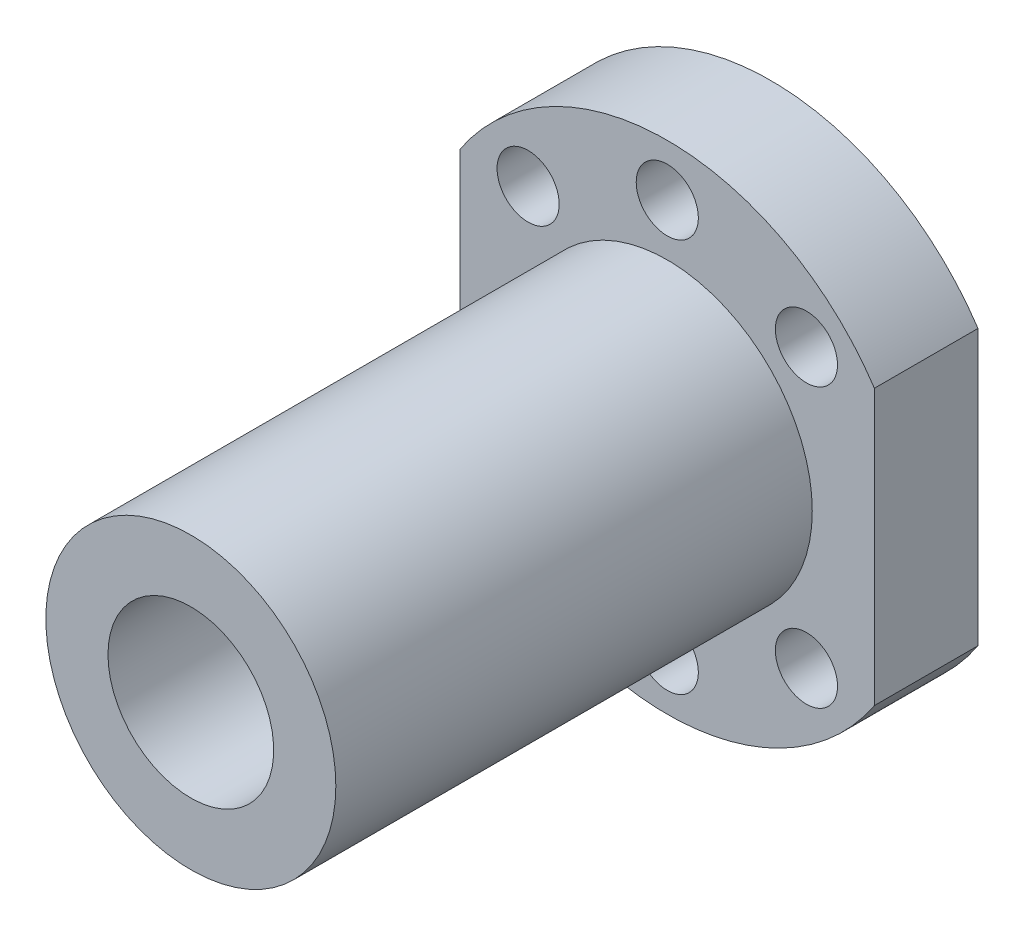
ISO-10303-21;
HEADER;
FILE_DESCRIPTION(('STEP AP214'),'2;1');
FILE_NAME('part.step','',(''),(''),'','','');
FILE_SCHEMA(('AUTOMOTIVE_DESIGN { 1 0 10303 214 1 1 1 1 }'));
ENDSEC;
DATA;
#1=APPLICATION_CONTEXT('core data for automotive mechanical design processes');
#2=APPLICATION_PROTOCOL_DEFINITION('international standard','automotive_design',2000,#1);
#3=PRODUCT_CONTEXT('',#1,'mechanical');
#4=PRODUCT('Part','Part','',(#3));
#5=PRODUCT_RELATED_PRODUCT_CATEGORY('part','',(#4));
#6=PRODUCT_DEFINITION_FORMATION('','',#4);
#7=PRODUCT_DEFINITION_CONTEXT('part definition',#1,'design');
#8=PRODUCT_DEFINITION('design','',#6,#7);
#9=PRODUCT_DEFINITION_SHAPE('','',#8);
#10=(LENGTH_UNIT() NAMED_UNIT(*) SI_UNIT(.MILLI.,.METRE.));
#11=(NAMED_UNIT(*) PLANE_ANGLE_UNIT() SI_UNIT($,.RADIAN.));
#12=(NAMED_UNIT(*) SI_UNIT($,.STERADIAN.) SOLID_ANGLE_UNIT());
#13=UNCERTAINTY_MEASURE_WITH_UNIT(LENGTH_MEASURE(1.E-05),#10,'distance_accuracy_value','');
#14=(GEOMETRIC_REPRESENTATION_CONTEXT(3) GLOBAL_UNCERTAINTY_ASSIGNED_CONTEXT((#13)) GLOBAL_UNIT_ASSIGNED_CONTEXT((#10,
#11,#12)) REPRESENTATION_CONTEXT('',''));
#15=CARTESIAN_POINT('',(0.,0.,0.));
#16=DIRECTION('',(0.,0.,1.));
#17=DIRECTION('',(1.,0.,0.));
#18=AXIS2_PLACEMENT_3D('',#15,#16,#17);
#19=CARTESIAN_POINT('',(0.,0.,0.));
#20=DIRECTION('',(0.,0.,1.));
#21=DIRECTION('',(1.,0.,0.));
#22=AXIS2_PLACEMENT_3D('',#19,#20,#21);
#23=PLANE('',#22);
#24=CARTESIAN_POINT('',(0.,0.,0.));
#25=DIRECTION('',(0.,0.,-1.));
#26=DIRECTION('',(-1.,0.,0.));
#27=AXIS2_PLACEMENT_3D('',#24,#25,#26);
#28=CIRCLE('',#27,7.99999999999999);
#29=CARTESIAN_POINT('',(-7.99999999999999,0.,0.));
#30=VERTEX_POINT('',#29);
#31=EDGE_CURVE('E145',#30,#30,#28,.T.);
#32=ORIENTED_EDGE('',*,*,#31,.F.);
#33=EDGE_LOOP('',(#32));
#34=FACE_BOUND('',#33,.T.);
#35=DIRECTION('',(0.,-1.,0.));
#36=VECTOR('',#35,1.);
#37=CARTESIAN_POINT('',(-20.,0.,0.));
#38=LINE('',#37,#36);
#39=CARTESIAN_POINT('',(-20.,13.2664991614216,0.));
#40=VERTEX_POINT('',#39);
#41=CARTESIAN_POINT('',(-20.,-13.2664991614216,0.));
#42=VERTEX_POINT('',#41);
#43=EDGE_CURVE('E12',#40,#42,#38,.T.);
#44=ORIENTED_EDGE('',*,*,#43,.F.);
#45=CARTESIAN_POINT('',(0.,0.,0.));
#46=DIRECTION('',(0.,0.,1.));
#47=DIRECTION('',(1.,0.,0.));
#48=AXIS2_PLACEMENT_3D('',#45,#46,#47);
#49=CIRCLE('',#48,24.);
#50=CARTESIAN_POINT('',(20.,13.2664991614216,0.));
#51=VERTEX_POINT('',#50);
#52=EDGE_CURVE('E84',#51,#40,#49,.T.);
#53=ORIENTED_EDGE('',*,*,#52,.F.);
#54=DIRECTION('',(0.,1.,0.));
#55=VECTOR('',#54,1.);
#56=CARTESIAN_POINT('',(20.,0.,0.));
#57=LINE('',#56,#55);
#58=CARTESIAN_POINT('',(20.,-13.2664991614216,0.));
#59=VERTEX_POINT('',#58);
#60=EDGE_CURVE('E42',#59,#51,#57,.T.);
#61=ORIENTED_EDGE('',*,*,#60,.F.);
#62=EDGE_CURVE('E91',#42,#59,#49,.T.);
#63=ORIENTED_EDGE('',*,*,#62,.F.);
#64=EDGE_LOOP('',(#44,#53,#61,#63));
#65=FACE_BOUND('',#64,.T.);
#66=CARTESIAN_POINT('',(0.,19.,0.));
#67=DIRECTION('',(0.,0.,-1.));
#68=DIRECTION('',(-1.,0.,0.));
#69=AXIS2_PLACEMENT_3D('',#66,#67,#68);
#70=CIRCLE('',#69,2.99999999999999);
#71=CARTESIAN_POINT('',(-2.99999999999999,19.,0.));
#72=VERTEX_POINT('',#71);
#73=EDGE_CURVE('E112',#72,#72,#70,.T.);
#74=ORIENTED_EDGE('',*,*,#73,.F.);
#75=EDGE_LOOP('',(#74));
#76=FACE_BOUND('',#75,.T.);
#77=CARTESIAN_POINT('',(-13.4350288425444,13.4350288425444,0.));
#78=DIRECTION('',(0.,0.,-1.));
#79=DIRECTION('',(-1.,0.,0.));
#80=AXIS2_PLACEMENT_3D('',#77,#78,#79);
#81=CIRCLE('',#80,2.99999999999999);
#82=CARTESIAN_POINT('',(-16.4350288425444,13.4350288425444,0.));
#83=VERTEX_POINT('',#82);
#84=EDGE_CURVE('E118',#83,#83,#81,.T.);
#85=ORIENTED_EDGE('',*,*,#84,.F.);
#86=EDGE_LOOP('',(#85));
#87=FACE_BOUND('',#86,.T.);
#88=CARTESIAN_POINT('',(-13.4350288425443,-13.4350288425445,0.));
#89=DIRECTION('',(0.,0.,-1.));
#90=DIRECTION('',(-1.,0.,0.));
#91=AXIS2_PLACEMENT_3D('',#88,#89,#90);
#92=CIRCLE('',#91,2.99999999999999);
#93=CARTESIAN_POINT('',(-16.4350288425443,-13.4350288425445,0.));
#94=VERTEX_POINT('',#93);
#95=EDGE_CURVE('E124',#94,#94,#92,.T.);
#96=ORIENTED_EDGE('',*,*,#95,.F.);
#97=EDGE_LOOP('',(#96));
#98=FACE_BOUND('',#97,.T.);
#99=CARTESIAN_POINT('',(1.32676290876039E-13,-19.,0.));
#100=DIRECTION('',(0.,0.,-1.));
#101=DIRECTION('',(-1.,0.,0.));
#102=AXIS2_PLACEMENT_3D('',#99,#100,#101);
#103=CIRCLE('',#102,2.99999999999999);
#104=CARTESIAN_POINT('',(-2.99999999999986,-19.,0.));
#105=VERTEX_POINT('',#104);
#106=EDGE_CURVE('E130',#105,#105,#103,.T.);
#107=ORIENTED_EDGE('',*,*,#106,.F.);
#108=EDGE_LOOP('',(#107));
#109=FACE_BOUND('',#108,.T.);
#110=CARTESIAN_POINT('',(13.4350288425445,-13.4350288425443,0.));
#111=DIRECTION('',(0.,0.,-1.));
#112=DIRECTION('',(-1.,0.,0.));
#113=AXIS2_PLACEMENT_3D('',#110,#111,#112);
#114=CIRCLE('',#113,2.99999999999999);
#115=CARTESIAN_POINT('',(10.4350288425445,-13.4350288425443,0.));
#116=VERTEX_POINT('',#115);
#117=EDGE_CURVE('E136',#116,#116,#114,.T.);
#118=ORIENTED_EDGE('',*,*,#117,.F.);
#119=EDGE_LOOP('',(#118));
#120=FACE_BOUND('',#119,.T.);
#121=CARTESIAN_POINT('',(13.4350288425442,13.4350288425446,0.));
#122=DIRECTION('',(0.,0.,-1.));
#123=DIRECTION('',(-1.,0.,0.));
#124=AXIS2_PLACEMENT_3D('',#121,#122,#123);
#125=CIRCLE('',#124,2.99999999999999);
#126=CARTESIAN_POINT('',(10.4350288425443,13.4350288425446,0.));
#127=VERTEX_POINT('',#126);
#128=EDGE_CURVE('E139',#127,#127,#125,.T.);
#129=ORIENTED_EDGE('',*,*,#128,.F.);
#130=EDGE_LOOP('',(#129));
#131=FACE_BOUND('',#130,.T.);
#132=ADVANCED_FACE('F33',(#34,#65,#76,#87,#98,#109,#120,#131),#23,.F.);
#133=CARTESIAN_POINT('',(0.,0.,10.));
#134=DIRECTION('',(0.,0.,1.));
#135=DIRECTION('',(1.,0.,0.));
#136=AXIS2_PLACEMENT_3D('',#133,#134,#135);
#137=PLANE('',#136);
#138=CARTESIAN_POINT('',(13.4350288425442,13.4350288425446,10.));
#139=DIRECTION('',(0.,0.,1.));
#140=DIRECTION('',(1.,0.,0.));
#141=AXIS2_PLACEMENT_3D('',#138,#139,#140);
#142=CIRCLE('',#141,2.99999999999999);
#143=CARTESIAN_POINT('',(16.4350288425442,13.4350288425446,10.));
#144=VERTEX_POINT('',#143);
#145=EDGE_CURVE('E37',#144,#144,#142,.T.);
#146=ORIENTED_EDGE('',*,*,#145,.F.);
#147=EDGE_LOOP('',(#146));
#148=FACE_BOUND('',#147,.T.);
#149=CARTESIAN_POINT('',(13.4350288425445,-13.4350288425443,10.));
#150=DIRECTION('',(0.,0.,1.));
#151=DIRECTION('',(1.,0.,0.));
#152=AXIS2_PLACEMENT_3D('',#149,#150,#151);
#153=CIRCLE('',#152,2.99999999999999);
#154=CARTESIAN_POINT('',(16.4350288425445,-13.4350288425443,10.));
#155=VERTEX_POINT('',#154);
#156=EDGE_CURVE('E133',#155,#155,#153,.T.);
#157=ORIENTED_EDGE('',*,*,#156,.F.);
#158=EDGE_LOOP('',(#157));
#159=FACE_BOUND('',#158,.T.);
#160=CARTESIAN_POINT('',(1.32676290876039E-13,-19.,10.));
#161=DIRECTION('',(0.,0.,1.));
#162=DIRECTION('',(1.,0.,0.));
#163=AXIS2_PLACEMENT_3D('',#160,#161,#162);
#164=CIRCLE('',#163,2.99999999999999);
#165=CARTESIAN_POINT('',(3.00000000000012,-19.,10.));
#166=VERTEX_POINT('',#165);
#167=EDGE_CURVE('E127',#166,#166,#164,.T.);
#168=ORIENTED_EDGE('',*,*,#167,.F.);
#169=EDGE_LOOP('',(#168));
#170=FACE_BOUND('',#169,.T.);
#171=CARTESIAN_POINT('',(-13.4350288425443,-13.4350288425445,10.));
#172=DIRECTION('',(0.,0.,1.));
#173=DIRECTION('',(1.,0.,0.));
#174=AXIS2_PLACEMENT_3D('',#171,#172,#173);
#175=CIRCLE('',#174,2.99999999999999);
#176=CARTESIAN_POINT('',(-10.4350288425443,-13.4350288425445,10.));
#177=VERTEX_POINT('',#176);
#178=EDGE_CURVE('E121',#177,#177,#175,.T.);
#179=ORIENTED_EDGE('',*,*,#178,.F.);
#180=EDGE_LOOP('',(#179));
#181=FACE_BOUND('',#180,.T.);
#182=CARTESIAN_POINT('',(-13.4350288425444,13.4350288425444,10.));
#183=DIRECTION('',(0.,0.,1.));
#184=DIRECTION('',(1.,0.,0.));
#185=AXIS2_PLACEMENT_3D('',#182,#183,#184);
#186=CIRCLE('',#185,2.99999999999999);
#187=CARTESIAN_POINT('',(-10.4350288425444,13.4350288425444,10.));
#188=VERTEX_POINT('',#187);
#189=EDGE_CURVE('E115',#188,#188,#186,.T.);
#190=ORIENTED_EDGE('',*,*,#189,.F.);
#191=EDGE_LOOP('',(#190));
#192=FACE_BOUND('',#191,.T.);
#193=CARTESIAN_POINT('',(0.,19.,10.));
#194=DIRECTION('',(0.,0.,1.));
#195=DIRECTION('',(1.,0.,0.));
#196=AXIS2_PLACEMENT_3D('',#193,#194,#195);
#197=CIRCLE('',#196,2.99999999999999);
#198=CARTESIAN_POINT('',(2.99999999999999,19.,10.));
#199=VERTEX_POINT('',#198);
#200=EDGE_CURVE('E87',#199,#199,#197,.T.);
#201=ORIENTED_EDGE('',*,*,#200,.F.);
#202=EDGE_LOOP('',(#201));
#203=FACE_BOUND('',#202,.T.);
#204=CARTESIAN_POINT('',(0.,0.,10.));
#205=DIRECTION('',(0.,0.,1.));
#206=DIRECTION('',(1.,0.,0.));
#207=AXIS2_PLACEMENT_3D('',#204,#205,#206);
#208=CIRCLE('',#207,14.);
#209=CARTESIAN_POINT('',(14.,0.,10.));
#210=VERTEX_POINT('',#209);
#211=EDGE_CURVE('E97',#210,#210,#208,.T.);
#212=ORIENTED_EDGE('',*,*,#211,.F.);
#213=EDGE_LOOP('',(#212));
#214=FACE_BOUND('',#213,.T.);
#215=CARTESIAN_POINT('',(0.,0.,10.));
#216=DIRECTION('',(0.,0.,1.));
#217=DIRECTION('',(1.,0.,0.));
#218=AXIS2_PLACEMENT_3D('',#215,#216,#217);
#219=CIRCLE('',#218,24.);
#220=CARTESIAN_POINT('',(20.,13.2664991614216,10.));
#221=VERTEX_POINT('',#220);
#222=CARTESIAN_POINT('',(-20.,13.2664991614216,10.));
#223=VERTEX_POINT('',#222);
#224=EDGE_CURVE('E79',#221,#223,#219,.T.);
#225=ORIENTED_EDGE('',*,*,#224,.T.);
#226=DIRECTION('',(0.,-1.,0.));
#227=VECTOR('',#226,1.);
#228=CARTESIAN_POINT('',(-20.,0.,10.));
#229=LINE('',#228,#227);
#230=CARTESIAN_POINT('',(-20.,-13.2664991614216,10.));
#231=VERTEX_POINT('',#230);
#232=EDGE_CURVE('E103',#223,#231,#229,.T.);
#233=ORIENTED_EDGE('',*,*,#232,.T.);
#234=CARTESIAN_POINT('',(20.,-13.2664991614216,10.));
#235=VERTEX_POINT('',#234);
#236=EDGE_CURVE('E90',#231,#235,#219,.T.);
#237=ORIENTED_EDGE('',*,*,#236,.T.);
#238=DIRECTION('',(0.,1.,0.));
#239=VECTOR('',#238,1.);
#240=CARTESIAN_POINT('',(20.,0.,10.));
#241=LINE('',#240,#239);
#242=EDGE_CURVE('E86',#235,#221,#241,.T.);
#243=ORIENTED_EDGE('',*,*,#242,.T.);
#244=EDGE_LOOP('',(#225,#233,#237,#243));
#245=FACE_BOUND('',#244,.T.);
#246=ADVANCED_FACE('F152',(#148,#159,#170,#181,#192,#203,#214,#245),#137,.T.);
#247=CARTESIAN_POINT('',(0.,0.,10.));
#248=DIRECTION('',(0.,0.,-1.));
#249=DIRECTION('',(-1.,0.,0.));
#250=AXIS2_PLACEMENT_3D('',#247,#248,#249);
#251=CYLINDRICAL_SURFACE('',#250,24.);
#252=DIRECTION('',(0.,0.,-1.));
#253=VECTOR('',#252,1.);
#254=CARTESIAN_POINT('',(-20.,13.2664991614216,10.));
#255=LINE('',#254,#253);
#256=EDGE_CURVE('E56',#223,#40,#255,.T.);
#257=ORIENTED_EDGE('',*,*,#256,.F.);
#258=ORIENTED_EDGE('',*,*,#224,.F.);
#259=DIRECTION('',(0.,0.,-1.));
#260=VECTOR('',#259,1.);
#261=CARTESIAN_POINT('',(20.,13.2664991614216,10.));
#262=LINE('',#261,#260);
#263=EDGE_CURVE('E73',#51,#221,#262,.F.);
#264=ORIENTED_EDGE('',*,*,#263,.F.);
#265=ORIENTED_EDGE('',*,*,#52,.T.);
#266=EDGE_LOOP('',(#257,#258,#264,#265));
#267=FACE_BOUND('',#266,.T.);
#268=ADVANCED_FACE('F35',(#267),#251,.T.);
#269=DIRECTION('',(0.,0.,-1.));
#270=VECTOR('',#269,1.);
#271=CARTESIAN_POINT('',(-20.,-13.2664991614216,10.));
#272=LINE('',#271,#270);
#273=EDGE_CURVE('E106',#42,#231,#272,.F.);
#274=ORIENTED_EDGE('',*,*,#273,.F.);
#275=ORIENTED_EDGE('',*,*,#62,.T.);
#276=DIRECTION('',(0.,0.,-1.));
#277=VECTOR('',#276,1.);
#278=CARTESIAN_POINT('',(20.,-13.2664991614216,10.));
#279=LINE('',#278,#277);
#280=EDGE_CURVE('E49',#235,#59,#279,.T.);
#281=ORIENTED_EDGE('',*,*,#280,.F.);
#282=ORIENTED_EDGE('',*,*,#236,.F.);
#283=EDGE_LOOP('',(#274,#275,#281,#282));
#284=FACE_BOUND('',#283,.T.);
#285=ADVANCED_FACE('F163',(#284),#251,.T.);
#286=CARTESIAN_POINT('',(0.,0.,56.));
#287=DIRECTION('',(0.,0.,-1.));
#288=DIRECTION('',(-1.,0.,0.));
#289=AXIS2_PLACEMENT_3D('',#286,#287,#288);
#290=CYLINDRICAL_SURFACE('',#289,14.);
#291=CARTESIAN_POINT('',(0.,0.,56.));
#292=DIRECTION('',(0.,0.,1.));
#293=DIRECTION('',(1.,0.,0.));
#294=AXIS2_PLACEMENT_3D('',#291,#292,#293);
#295=CIRCLE('',#294,14.);
#296=CARTESIAN_POINT('',(14.,0.,56.));
#297=VERTEX_POINT('',#296);
#298=EDGE_CURVE('E95',#297,#297,#295,.T.);
#299=ORIENTED_EDGE('',*,*,#298,.F.);
#300=EDGE_LOOP('',(#299));
#301=FACE_BOUND('',#300,.T.);
#302=ORIENTED_EDGE('',*,*,#211,.T.);
#303=EDGE_LOOP('',(#302));
#304=FACE_BOUND('',#303,.T.);
#305=ADVANCED_FACE('F159',(#301,#304),#290,.T.);
#306=CARTESIAN_POINT('',(0.,0.,56.));
#307=DIRECTION('',(0.,0.,1.));
#308=DIRECTION('',(1.,0.,0.));
#309=AXIS2_PLACEMENT_3D('',#306,#307,#308);
#310=PLANE('',#309);
#311=CARTESIAN_POINT('',(0.,0.,56.));
#312=DIRECTION('',(0.,0.,-1.));
#313=DIRECTION('',(-1.,0.,0.));
#314=AXIS2_PLACEMENT_3D('',#311,#312,#313);
#315=CIRCLE('',#314,7.99999999999998);
#316=CARTESIAN_POINT('',(-7.99999999999998,0.,56.));
#317=VERTEX_POINT('',#316);
#318=EDGE_CURVE('E142',#317,#317,#315,.T.);
#319=ORIENTED_EDGE('',*,*,#318,.T.);
#320=EDGE_LOOP('',(#319));
#321=FACE_BOUND('',#320,.T.);
#322=ORIENTED_EDGE('',*,*,#298,.T.);
#323=EDGE_LOOP('',(#322));
#324=FACE_BOUND('',#323,.T.);
#325=ADVANCED_FACE('F162',(#321,#324),#310,.T.);
#326=CARTESIAN_POINT('',(20.,-36.555493028825,56.));
#327=DIRECTION('',(1.,0.,0.));
#328=DIRECTION('',(0.,0.,-1.));
#329=AXIS2_PLACEMENT_3D('',#326,#327,#328);
#330=PLANE('',#329);
#331=ORIENTED_EDGE('',*,*,#280,.T.);
#332=ORIENTED_EDGE('',*,*,#60,.T.);
#333=ORIENTED_EDGE('',*,*,#263,.T.);
#334=ORIENTED_EDGE('',*,*,#242,.F.);
#335=EDGE_LOOP('',(#331,#332,#333,#334));
#336=FACE_BOUND('',#335,.T.);
#337=ADVANCED_FACE('F72',(#336),#330,.T.);
#338=CARTESIAN_POINT('',(-20.,-36.555493028825,56.));
#339=DIRECTION('',(-1.,0.,0.));
#340=DIRECTION('',(0.,0.,1.));
#341=AXIS2_PLACEMENT_3D('',#338,#339,#340);
#342=PLANE('',#341);
#343=ORIENTED_EDGE('',*,*,#256,.T.);
#344=ORIENTED_EDGE('',*,*,#43,.T.);
#345=ORIENTED_EDGE('',*,*,#273,.T.);
#346=ORIENTED_EDGE('',*,*,#232,.F.);
#347=EDGE_LOOP('',(#343,#344,#345,#346));
#348=FACE_BOUND('',#347,.T.);
#349=ADVANCED_FACE('F168',(#348),#342,.T.);
#350=CARTESIAN_POINT('',(0.,19.,0.));
#351=DIRECTION('',(0.,0.,-1.));
#352=DIRECTION('',(-1.,0.,0.));
#353=AXIS2_PLACEMENT_3D('',#350,#351,#352);
#354=CYLINDRICAL_SURFACE('',#353,2.99999999999999);
#355=ORIENTED_EDGE('',*,*,#200,.T.);
#356=EDGE_LOOP('',(#355));
#357=FACE_BOUND('',#356,.T.);
#358=ORIENTED_EDGE('',*,*,#73,.T.);
#359=EDGE_LOOP('',(#358));
#360=FACE_BOUND('',#359,.T.);
#361=ADVANCED_FACE('F171',(#357,#360),#354,.F.);
#362=CARTESIAN_POINT('',(-13.4350288425444,13.4350288425444,0.));
#363=DIRECTION('',(0.,0.,-1.));
#364=DIRECTION('',(-1.,0.,0.));
#365=AXIS2_PLACEMENT_3D('',#362,#363,#364);
#366=CYLINDRICAL_SURFACE('',#365,2.99999999999999);
#367=ORIENTED_EDGE('',*,*,#189,.T.);
#368=EDGE_LOOP('',(#367));
#369=FACE_BOUND('',#368,.T.);
#370=ORIENTED_EDGE('',*,*,#84,.T.);
#371=EDGE_LOOP('',(#370));
#372=FACE_BOUND('',#371,.T.);
#373=ADVANCED_FACE('F176',(#369,#372),#366,.F.);
#374=CARTESIAN_POINT('',(-13.4350288425443,-13.4350288425445,0.));
#375=DIRECTION('',(0.,0.,-1.));
#376=DIRECTION('',(-1.,0.,0.));
#377=AXIS2_PLACEMENT_3D('',#374,#375,#376);
#378=CYLINDRICAL_SURFACE('',#377,2.99999999999999);
#379=ORIENTED_EDGE('',*,*,#178,.T.);
#380=EDGE_LOOP('',(#379));
#381=FACE_BOUND('',#380,.T.);
#382=ORIENTED_EDGE('',*,*,#95,.T.);
#383=EDGE_LOOP('',(#382));
#384=FACE_BOUND('',#383,.T.);
#385=ADVANCED_FACE('F180',(#381,#384),#378,.F.);
#386=CARTESIAN_POINT('',(1.32676290876039E-13,-19.,0.));
#387=DIRECTION('',(0.,0.,-1.));
#388=DIRECTION('',(-1.,0.,0.));
#389=AXIS2_PLACEMENT_3D('',#386,#387,#388);
#390=CYLINDRICAL_SURFACE('',#389,2.99999999999999);
#391=ORIENTED_EDGE('',*,*,#167,.T.);
#392=EDGE_LOOP('',(#391));
#393=FACE_BOUND('',#392,.T.);
#394=ORIENTED_EDGE('',*,*,#106,.T.);
#395=EDGE_LOOP('',(#394));
#396=FACE_BOUND('',#395,.T.);
#397=ADVANCED_FACE('F184',(#393,#396),#390,.F.);
#398=CARTESIAN_POINT('',(13.4350288425445,-13.4350288425443,0.));
#399=DIRECTION('',(0.,0.,-1.));
#400=DIRECTION('',(-1.,0.,0.));
#401=AXIS2_PLACEMENT_3D('',#398,#399,#400);
#402=CYLINDRICAL_SURFACE('',#401,2.99999999999999);
#403=ORIENTED_EDGE('',*,*,#156,.T.);
#404=EDGE_LOOP('',(#403));
#405=FACE_BOUND('',#404,.T.);
#406=ORIENTED_EDGE('',*,*,#117,.T.);
#407=EDGE_LOOP('',(#406));
#408=FACE_BOUND('',#407,.T.);
#409=ADVANCED_FACE('F188',(#405,#408),#402,.F.);
#410=CARTESIAN_POINT('',(13.4350288425442,13.4350288425446,0.));
#411=DIRECTION('',(0.,0.,-1.));
#412=DIRECTION('',(-1.,0.,0.));
#413=AXIS2_PLACEMENT_3D('',#410,#411,#412);
#414=CYLINDRICAL_SURFACE('',#413,2.99999999999999);
#415=ORIENTED_EDGE('',*,*,#145,.T.);
#416=EDGE_LOOP('',(#415));
#417=FACE_BOUND('',#416,.T.);
#418=ORIENTED_EDGE('',*,*,#128,.T.);
#419=EDGE_LOOP('',(#418));
#420=FACE_BOUND('',#419,.T.);
#421=ADVANCED_FACE('F192',(#417,#420),#414,.F.);
#422=CARTESIAN_POINT('',(0.,0.,0.));
#423=DIRECTION('',(0.,0.,-1.));
#424=DIRECTION('',(-1.,0.,0.));
#425=AXIS2_PLACEMENT_3D('',#422,#423,#424);
#426=CYLINDRICAL_SURFACE('',#425,7.99999999999999);
#427=ORIENTED_EDGE('',*,*,#318,.F.);
#428=EDGE_LOOP('',(#427));
#429=FACE_BOUND('',#428,.T.);
#430=ORIENTED_EDGE('',*,*,#31,.T.);
#431=EDGE_LOOP('',(#430));
#432=FACE_BOUND('',#431,.T.);
#433=ADVANCED_FACE('F149',(#429,#432),#426,.F.);
#434=CLOSED_SHELL('',(#132,#246,#268,#285,#305,#325,#337,#349,#361,#373,#385,#397,#409,#421,#433));
#435=MANIFOLD_SOLID_BREP('B2',#434);
#436=ADVANCED_BREP_SHAPE_REPRESENTATION('',(#18,#435),#14);
#437=SHAPE_DEFINITION_REPRESENTATION(#9,#436);
ENDSEC;
END-ISO-10303-21;
